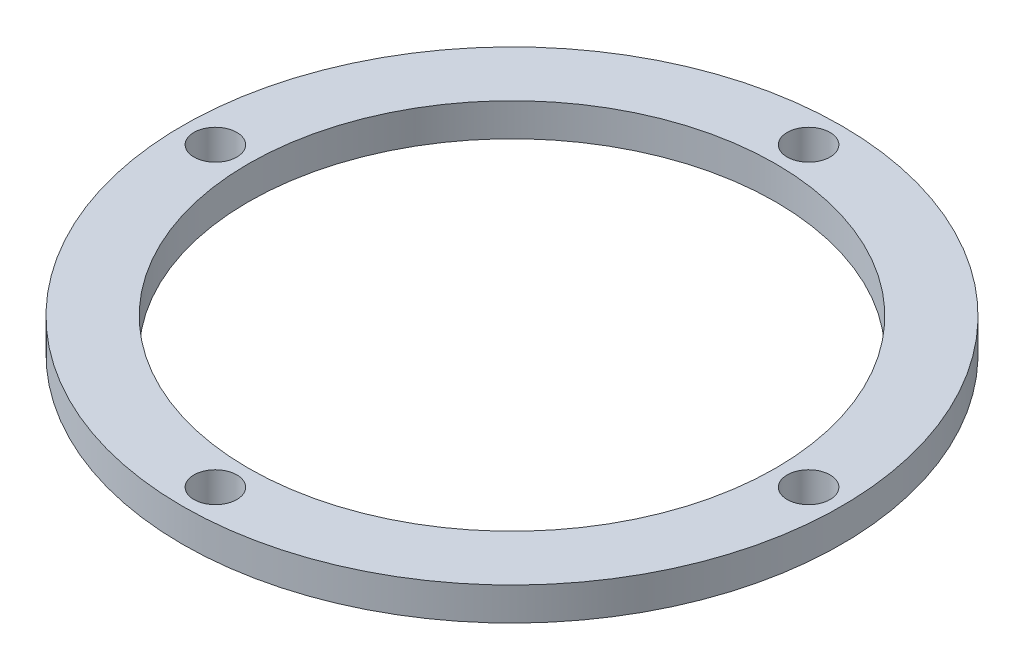
ISO-10303-21;
HEADER;
FILE_DESCRIPTION(('STEP AP214'),'2;1');
FILE_NAME('part.step','',(''),(''),'','','');
FILE_SCHEMA(('AUTOMOTIVE_DESIGN { 1 0 10303 214 1 1 1 1 }'));
ENDSEC;
DATA;
#1=APPLICATION_CONTEXT('core data for automotive mechanical design processes');
#2=APPLICATION_PROTOCOL_DEFINITION('international standard','automotive_design',2000,#1);
#3=PRODUCT_CONTEXT('',#1,'mechanical');
#4=PRODUCT('Part','Part','',(#3));
#5=PRODUCT_RELATED_PRODUCT_CATEGORY('part','',(#4));
#6=PRODUCT_DEFINITION_FORMATION('','',#4);
#7=PRODUCT_DEFINITION_CONTEXT('part definition',#1,'design');
#8=PRODUCT_DEFINITION('design','',#6,#7);
#9=PRODUCT_DEFINITION_SHAPE('','',#8);
#10=(LENGTH_UNIT() NAMED_UNIT(*) SI_UNIT(.MILLI.,.METRE.));
#11=(NAMED_UNIT(*) PLANE_ANGLE_UNIT() SI_UNIT($,.RADIAN.));
#12=(NAMED_UNIT(*) SI_UNIT($,.STERADIAN.) SOLID_ANGLE_UNIT());
#13=UNCERTAINTY_MEASURE_WITH_UNIT(LENGTH_MEASURE(1.E-05),#10,'distance_accuracy_value','');
#14=(GEOMETRIC_REPRESENTATION_CONTEXT(3) GLOBAL_UNCERTAINTY_ASSIGNED_CONTEXT((#13)) GLOBAL_UNIT_ASSIGNED_CONTEXT((#10,
#11,#12)) REPRESENTATION_CONTEXT('',''));
#15=CARTESIAN_POINT('',(0.,0.,0.));
#16=DIRECTION('',(0.,0.,1.));
#17=DIRECTION('',(1.,0.,0.));
#18=AXIS2_PLACEMENT_3D('',#15,#16,#17);
#19=CARTESIAN_POINT('',(0.,0.,0.));
#20=DIRECTION('',(0.,1.,0.));
#21=DIRECTION('',(0.,0.,1.));
#22=AXIS2_PLACEMENT_3D('',#19,#20,#21);
#23=PLANE('',#22);
#24=CARTESIAN_POINT('',(0.,0.,0.));
#25=DIRECTION('',(0.,-1.,0.));
#26=DIRECTION('',(0.,0.,-1.));
#27=AXIS2_PLACEMENT_3D('',#24,#25,#26);
#28=CIRCLE('',#27,80.);
#29=CARTESIAN_POINT('',(0.,0.,-80.));
#30=VERTEX_POINT('',#29);
#31=EDGE_CURVE('E41',#30,#30,#28,.F.);
#32=ORIENTED_EDGE('',*,*,#31,.T.);
#33=EDGE_LOOP('',(#32));
#34=FACE_BOUND('',#33,.T.);
#35=CARTESIAN_POINT('',(0.,0.,0.));
#36=DIRECTION('',(0.,-1.,0.));
#37=DIRECTION('',(0.,0.,-1.));
#38=AXIS2_PLACEMENT_3D('',#35,#36,#37);
#39=CIRCLE('',#38,100.);
#40=CARTESIAN_POINT('',(0.,0.,-100.));
#41=VERTEX_POINT('',#40);
#42=EDGE_CURVE('E44',#41,#41,#39,.F.);
#43=ORIENTED_EDGE('',*,*,#42,.F.);
#44=EDGE_LOOP('',(#43));
#45=FACE_BOUND('',#44,.T.);
#46=CARTESIAN_POINT('',(0.,0.,-90.));
#47=DIRECTION('',(0.,1.,0.));
#48=DIRECTION('',(0.,0.,1.));
#49=AXIS2_PLACEMENT_3D('',#46,#47,#48);
#50=CIRCLE('',#49,6.5);
#51=CARTESIAN_POINT('',(0.,0.,-83.5));
#52=VERTEX_POINT('',#51);
#53=EDGE_CURVE('E47',#52,#52,#50,.T.);
#54=ORIENTED_EDGE('',*,*,#53,.T.);
#55=EDGE_LOOP('',(#54));
#56=FACE_BOUND('',#55,.T.);
#57=CARTESIAN_POINT('',(-90.,0.,3.14233320495882E-13));
#58=DIRECTION('',(0.,1.,0.));
#59=DIRECTION('',(0.,0.,1.));
#60=AXIS2_PLACEMENT_3D('',#57,#58,#59);
#61=CIRCLE('',#60,6.5);
#62=CARTESIAN_POINT('',(-90.,0.,6.50000000000031));
#63=VERTEX_POINT('',#62);
#64=EDGE_CURVE('E50',#63,#63,#61,.T.);
#65=ORIENTED_EDGE('',*,*,#64,.T.);
#66=EDGE_LOOP('',(#65));
#67=FACE_BOUND('',#66,.T.);
#68=CARTESIAN_POINT('',(0.,0.,90.));
#69=DIRECTION('',(0.,1.,0.));
#70=DIRECTION('',(0.,0.,1.));
#71=AXIS2_PLACEMENT_3D('',#68,#69,#70);
#72=CIRCLE('',#71,6.5);
#73=CARTESIAN_POINT('',(0.,0.,96.5));
#74=VERTEX_POINT('',#73);
#75=EDGE_CURVE('E52',#74,#74,#72,.T.);
#76=ORIENTED_EDGE('',*,*,#75,.T.);
#77=EDGE_LOOP('',(#76));
#78=FACE_BOUND('',#77,.T.);
#79=CARTESIAN_POINT('',(90.,0.,-9.42699961487646E-13));
#80=DIRECTION('',(0.,1.,0.));
#81=DIRECTION('',(0.,0.,1.));
#82=AXIS2_PLACEMENT_3D('',#79,#80,#81);
#83=CIRCLE('',#82,6.5);
#84=CARTESIAN_POINT('',(90.,0.,6.49999999999906));
#85=VERTEX_POINT('',#84);
#86=EDGE_CURVE('E18',#85,#85,#83,.T.);
#87=ORIENTED_EDGE('',*,*,#86,.T.);
#88=EDGE_LOOP('',(#87));
#89=FACE_BOUND('',#88,.T.);
#90=ADVANCED_FACE('F15',(#34,#45,#56,#67,#78,#89),#23,.F.);
#91=CARTESIAN_POINT('',(90.,10.,-9.42699961487646E-13));
#92=DIRECTION('',(0.,1.,0.));
#93=DIRECTION('',(0.,0.,1.));
#94=AXIS2_PLACEMENT_3D('',#91,#92,#93);
#95=CYLINDRICAL_SURFACE('',#94,6.5);
#96=CARTESIAN_POINT('',(90.,10.,-9.42699961487646E-13));
#97=DIRECTION('',(0.,1.,0.));
#98=DIRECTION('',(0.,0.,1.));
#99=AXIS2_PLACEMENT_3D('',#96,#97,#98);
#100=CIRCLE('',#99,6.5);
#101=CARTESIAN_POINT('',(90.,10.,6.49999999999906));
#102=VERTEX_POINT('',#101);
#103=EDGE_CURVE('E38',#102,#102,#100,.F.);
#104=ORIENTED_EDGE('',*,*,#103,.F.);
#105=EDGE_LOOP('',(#104));
#106=FACE_BOUND('',#105,.T.);
#107=ORIENTED_EDGE('',*,*,#86,.F.);
#108=EDGE_LOOP('',(#107));
#109=FACE_BOUND('',#108,.T.);
#110=ADVANCED_FACE('F60',(#106,#109),#95,.F.);
#111=CARTESIAN_POINT('',(0.,10.,90.));
#112=DIRECTION('',(0.,1.,0.));
#113=DIRECTION('',(0.,0.,1.));
#114=AXIS2_PLACEMENT_3D('',#111,#112,#113);
#115=CYLINDRICAL_SURFACE('',#114,6.5);
#116=CARTESIAN_POINT('',(0.,10.,90.));
#117=DIRECTION('',(0.,1.,0.));
#118=DIRECTION('',(0.,0.,1.));
#119=AXIS2_PLACEMENT_3D('',#116,#117,#118);
#120=CIRCLE('',#119,6.5);
#121=CARTESIAN_POINT('',(0.,10.,96.5));
#122=VERTEX_POINT('',#121);
#123=EDGE_CURVE('E35',#122,#122,#120,.F.);
#124=ORIENTED_EDGE('',*,*,#123,.F.);
#125=EDGE_LOOP('',(#124));
#126=FACE_BOUND('',#125,.T.);
#127=ORIENTED_EDGE('',*,*,#75,.F.);
#128=EDGE_LOOP('',(#127));
#129=FACE_BOUND('',#128,.T.);
#130=ADVANCED_FACE('F62',(#126,#129),#115,.F.);
#131=CARTESIAN_POINT('',(-90.,10.,3.14233320495882E-13));
#132=DIRECTION('',(0.,1.,0.));
#133=DIRECTION('',(0.,0.,1.));
#134=AXIS2_PLACEMENT_3D('',#131,#132,#133);
#135=CYLINDRICAL_SURFACE('',#134,6.5);
#136=CARTESIAN_POINT('',(-90.,10.,3.14233320495882E-13));
#137=DIRECTION('',(0.,1.,0.));
#138=DIRECTION('',(0.,0.,1.));
#139=AXIS2_PLACEMENT_3D('',#136,#137,#138);
#140=CIRCLE('',#139,6.5);
#141=CARTESIAN_POINT('',(-90.,10.,6.50000000000031));
#142=VERTEX_POINT('',#141);
#143=EDGE_CURVE('E32',#142,#142,#140,.F.);
#144=ORIENTED_EDGE('',*,*,#143,.F.);
#145=EDGE_LOOP('',(#144));
#146=FACE_BOUND('',#145,.T.);
#147=ORIENTED_EDGE('',*,*,#64,.F.);
#148=EDGE_LOOP('',(#147));
#149=FACE_BOUND('',#148,.T.);
#150=ADVANCED_FACE('F70',(#146,#149),#135,.F.);
#151=CARTESIAN_POINT('',(0.,10.,-90.));
#152=DIRECTION('',(0.,1.,0.));
#153=DIRECTION('',(0.,0.,1.));
#154=AXIS2_PLACEMENT_3D('',#151,#152,#153);
#155=CYLINDRICAL_SURFACE('',#154,6.5);
#156=CARTESIAN_POINT('',(0.,10.,-90.));
#157=DIRECTION('',(0.,1.,0.));
#158=DIRECTION('',(0.,0.,1.));
#159=AXIS2_PLACEMENT_3D('',#156,#157,#158);
#160=CIRCLE('',#159,6.5);
#161=CARTESIAN_POINT('',(0.,10.,-83.5));
#162=VERTEX_POINT('',#161);
#163=EDGE_CURVE('E27',#162,#162,#160,.F.);
#164=ORIENTED_EDGE('',*,*,#163,.F.);
#165=EDGE_LOOP('',(#164));
#166=FACE_BOUND('',#165,.T.);
#167=ORIENTED_EDGE('',*,*,#53,.F.);
#168=EDGE_LOOP('',(#167));
#169=FACE_BOUND('',#168,.T.);
#170=ADVANCED_FACE('F90',(#166,#169),#155,.F.);
#171=CARTESIAN_POINT('',(0.,10.,0.));
#172=DIRECTION('',(0.,-1.,0.));
#173=DIRECTION('',(0.,0.,-1.));
#174=AXIS2_PLACEMENT_3D('',#171,#172,#173);
#175=CYLINDRICAL_SURFACE('',#174,100.);
#176=ORIENTED_EDGE('',*,*,#42,.T.);
#177=EDGE_LOOP('',(#176));
#178=FACE_BOUND('',#177,.T.);
#179=CARTESIAN_POINT('',(0.,10.,0.));
#180=DIRECTION('',(0.,-1.,0.));
#181=DIRECTION('',(0.,0.,-1.));
#182=AXIS2_PLACEMENT_3D('',#179,#180,#181);
#183=CIRCLE('',#182,100.);
#184=CARTESIAN_POINT('',(0.,10.,-100.));
#185=VERTEX_POINT('',#184);
#186=EDGE_CURVE('E22',#185,#185,#183,.F.);
#187=ORIENTED_EDGE('',*,*,#186,.F.);
#188=EDGE_LOOP('',(#187));
#189=FACE_BOUND('',#188,.T.);
#190=ADVANCED_FACE('F83',(#178,#189),#175,.T.);
#191=CARTESIAN_POINT('',(0.,10.,0.));
#192=DIRECTION('',(0.,-1.,0.));
#193=DIRECTION('',(0.,0.,-1.));
#194=AXIS2_PLACEMENT_3D('',#191,#192,#193);
#195=CYLINDRICAL_SURFACE('',#194,80.);
#196=CARTESIAN_POINT('',(0.,10.,0.));
#197=DIRECTION('',(0.,-1.,0.));
#198=DIRECTION('',(0.,0.,-1.));
#199=AXIS2_PLACEMENT_3D('',#196,#197,#198);
#200=CIRCLE('',#199,80.);
#201=CARTESIAN_POINT('',(0.,10.,-80.));
#202=VERTEX_POINT('',#201);
#203=EDGE_CURVE('E10',#202,#202,#200,.T.);
#204=ORIENTED_EDGE('',*,*,#203,.F.);
#205=EDGE_LOOP('',(#204));
#206=FACE_BOUND('',#205,.T.);
#207=ORIENTED_EDGE('',*,*,#31,.F.);
#208=EDGE_LOOP('',(#207));
#209=FACE_BOUND('',#208,.T.);
#210=ADVANCED_FACE('F77',(#206,#209),#195,.F.);
#211=CARTESIAN_POINT('',(0.,10.,0.));
#212=DIRECTION('',(0.,1.,0.));
#213=DIRECTION('',(0.,0.,1.));
#214=AXIS2_PLACEMENT_3D('',#211,#212,#213);
#215=PLANE('',#214);
#216=ORIENTED_EDGE('',*,*,#203,.T.);
#217=EDGE_LOOP('',(#216));
#218=FACE_BOUND('',#217,.T.);
#219=ORIENTED_EDGE('',*,*,#186,.T.);
#220=EDGE_LOOP('',(#219));
#221=FACE_BOUND('',#220,.T.);
#222=ORIENTED_EDGE('',*,*,#163,.T.);
#223=EDGE_LOOP('',(#222));
#224=FACE_BOUND('',#223,.T.);
#225=ORIENTED_EDGE('',*,*,#143,.T.);
#226=EDGE_LOOP('',(#225));
#227=FACE_BOUND('',#226,.T.);
#228=ORIENTED_EDGE('',*,*,#123,.T.);
#229=EDGE_LOOP('',(#228));
#230=FACE_BOUND('',#229,.T.);
#231=ORIENTED_EDGE('',*,*,#103,.T.);
#232=EDGE_LOOP('',(#231));
#233=FACE_BOUND('',#232,.T.);
#234=ADVANCED_FACE('F75',(#218,#221,#224,#227,#230,#233),#215,.T.);
#235=CLOSED_SHELL('',(#90,#110,#130,#150,#170,#190,#210,#234));
#236=MANIFOLD_SOLID_BREP('B1',#235);
#237=ADVANCED_BREP_SHAPE_REPRESENTATION('',(#18,#236),#14);
#238=SHAPE_DEFINITION_REPRESENTATION(#9,#237);
ENDSEC;
END-ISO-10303-21;
